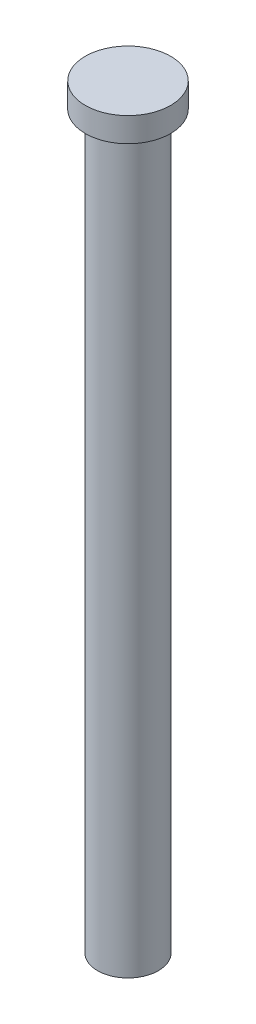
ISO-10303-21;
HEADER;
FILE_DESCRIPTION(('STEP AP214'),'2;1');
FILE_NAME('part.step','',(''),(''),'','','');
FILE_SCHEMA(('AUTOMOTIVE_DESIGN { 1 0 10303 214 1 1 1 1 }'));
ENDSEC;
DATA;
#1=APPLICATION_CONTEXT('core data for automotive mechanical design processes');
#2=APPLICATION_PROTOCOL_DEFINITION('international standard','automotive_design',2000,#1);
#3=PRODUCT_CONTEXT('',#1,'mechanical');
#4=PRODUCT('Part','Part','',(#3));
#5=PRODUCT_RELATED_PRODUCT_CATEGORY('part','',(#4));
#6=PRODUCT_DEFINITION_FORMATION('','',#4);
#7=PRODUCT_DEFINITION_CONTEXT('part definition',#1,'design');
#8=PRODUCT_DEFINITION('design','',#6,#7);
#9=PRODUCT_DEFINITION_SHAPE('','',#8);
#10=(LENGTH_UNIT() NAMED_UNIT(*) SI_UNIT(.MILLI.,.METRE.));
#11=(NAMED_UNIT(*) PLANE_ANGLE_UNIT() SI_UNIT($,.RADIAN.));
#12=(NAMED_UNIT(*) SI_UNIT($,.STERADIAN.) SOLID_ANGLE_UNIT());
#13=UNCERTAINTY_MEASURE_WITH_UNIT(LENGTH_MEASURE(1.E-05),#10,'distance_accuracy_value','');
#14=(GEOMETRIC_REPRESENTATION_CONTEXT(3) GLOBAL_UNCERTAINTY_ASSIGNED_CONTEXT((#13)) GLOBAL_UNIT_ASSIGNED_CONTEXT((#10,
#11,#12)) REPRESENTATION_CONTEXT('',''));
#15=CARTESIAN_POINT('',(0.,0.,0.));
#16=DIRECTION('',(0.,0.,1.));
#17=DIRECTION('',(1.,0.,0.));
#18=AXIS2_PLACEMENT_3D('',#15,#16,#17);
#19=CARTESIAN_POINT('',(0.,152.4,0.));
#20=DIRECTION('',(0.,-1.,0.));
#21=DIRECTION('',(0.,0.,-1.));
#22=AXIS2_PLACEMENT_3D('',#19,#20,#21);
#23=CYLINDRICAL_SURFACE('',#22,6.35);
#24=CARTESIAN_POINT('',(0.,152.4,0.));
#25=DIRECTION('',(0.,1.,0.));
#26=DIRECTION('',(0.,0.,1.));
#27=AXIS2_PLACEMENT_3D('',#24,#25,#26);
#28=CIRCLE('',#27,6.35);
#29=CARTESIAN_POINT('',(0.,152.4,-6.35));
#30=VERTEX_POINT('',#29);
#31=EDGE_CURVE('E10',#30,#30,#28,.T.);
#32=CARTESIAN_POINT('',(0.,0.,0.));
#33=DIRECTION('',(0.,1.,0.));
#34=DIRECTION('',(0.,0.,1.));
#35=AXIS2_PLACEMENT_3D('',#32,#33,#34);
#36=CIRCLE('',#35,6.35);
#37=CARTESIAN_POINT('',(0.,0.,-6.35));
#38=VERTEX_POINT('',#37);
#39=EDGE_CURVE('E38',#38,#38,#36,.T.);
#40=CARTESIAN_POINT('',(0.,152.4,-6.35));
#41=CARTESIAN_POINT('',(0.,150.8125,-6.35));
#42=CARTESIAN_POINT('',(0.,149.225,-6.35));
#43=CARTESIAN_POINT('',(0.,146.05,-6.35));
#44=CARTESIAN_POINT('',(0.,144.4625,-6.35));
#45=CARTESIAN_POINT('',(0.,141.2875,-6.35));
#46=CARTESIAN_POINT('',(0.,139.7,-6.35));
#47=CARTESIAN_POINT('',(0.,136.525,-6.35));
#48=CARTESIAN_POINT('',(0.,134.9375,-6.35));
#49=CARTESIAN_POINT('',(0.,131.7625,-6.35));
#50=CARTESIAN_POINT('',(0.,130.175,-6.35));
#51=CARTESIAN_POINT('',(0.,127.,-6.35));
#52=CARTESIAN_POINT('',(0.,125.4125,-6.35));
#53=CARTESIAN_POINT('',(0.,122.2375,-6.35));
#54=CARTESIAN_POINT('',(0.,120.65,-6.35));
#55=CARTESIAN_POINT('',(0.,117.475,-6.35));
#56=CARTESIAN_POINT('',(0.,115.8875,-6.35));
#57=CARTESIAN_POINT('',(0.,112.7125,-6.35));
#58=CARTESIAN_POINT('',(0.,111.125,-6.35));
#59=CARTESIAN_POINT('',(0.,107.95,-6.35));
#60=CARTESIAN_POINT('',(0.,106.3625,-6.35));
#61=CARTESIAN_POINT('',(0.,103.1875,-6.35));
#62=CARTESIAN_POINT('',(0.,101.6,-6.35));
#63=CARTESIAN_POINT('',(0.,98.425,-6.35));
#64=CARTESIAN_POINT('',(0.,96.8375,-6.35));
#65=CARTESIAN_POINT('',(0.,93.6625,-6.35));
#66=CARTESIAN_POINT('',(0.,92.075,-6.35));
#67=CARTESIAN_POINT('',(0.,88.9,-6.35));
#68=CARTESIAN_POINT('',(0.,87.3125,-6.35));
#69=CARTESIAN_POINT('',(0.,84.1375,-6.35));
#70=CARTESIAN_POINT('',(0.,82.55,-6.35));
#71=CARTESIAN_POINT('',(0.,79.375,-6.35));
#72=CARTESIAN_POINT('',(0.,77.7875,-6.35));
#73=CARTESIAN_POINT('',(0.,74.6125,-6.35));
#74=CARTESIAN_POINT('',(0.,73.025,-6.35));
#75=CARTESIAN_POINT('',(0.,69.85,-6.35));
#76=CARTESIAN_POINT('',(0.,68.2625,-6.35));
#77=CARTESIAN_POINT('',(0.,65.0875,-6.35));
#78=CARTESIAN_POINT('',(0.,63.5,-6.35));
#79=CARTESIAN_POINT('',(0.,60.325,-6.35));
#80=CARTESIAN_POINT('',(0.,58.7375,-6.35));
#81=CARTESIAN_POINT('',(0.,55.5625,-6.35));
#82=CARTESIAN_POINT('',(0.,53.975,-6.35));
#83=CARTESIAN_POINT('',(0.,50.8,-6.35));
#84=CARTESIAN_POINT('',(0.,49.2125,-6.35));
#85=CARTESIAN_POINT('',(0.,46.0375,-6.35));
#86=CARTESIAN_POINT('',(0.,44.45,-6.35));
#87=CARTESIAN_POINT('',(0.,41.275,-6.35));
#88=CARTESIAN_POINT('',(0.,39.6875,-6.35));
#89=CARTESIAN_POINT('',(0.,36.5125,-6.35));
#90=CARTESIAN_POINT('',(0.,34.925,-6.35));
#91=CARTESIAN_POINT('',(0.,31.75,-6.35));
#92=CARTESIAN_POINT('',(0.,30.1625,-6.35));
#93=CARTESIAN_POINT('',(0.,26.9875,-6.35));
#94=CARTESIAN_POINT('',(0.,25.4,-6.35));
#95=CARTESIAN_POINT('',(0.,22.225,-6.35));
#96=CARTESIAN_POINT('',(0.,20.6375,-6.35));
#97=CARTESIAN_POINT('',(0.,17.4625,-6.35));
#98=CARTESIAN_POINT('',(0.,15.875,-6.35));
#99=CARTESIAN_POINT('',(0.,12.7,-6.35));
#100=CARTESIAN_POINT('',(0.,11.1125,-6.35));
#101=CARTESIAN_POINT('',(0.,7.93750000000001,-6.35));
#102=CARTESIAN_POINT('',(0.,6.35,-6.35));
#103=CARTESIAN_POINT('',(0.,3.175,-6.35));
#104=CARTESIAN_POINT('',(0.,1.5875,-6.35));
#105=CARTESIAN_POINT('',(0.,0.,-6.35));
#106=B_SPLINE_CURVE_WITH_KNOTS('',3,(#40,#41,#42,#43,#44,#45,#46,#47,#48,#49,#50,#51,#52,#53,
#54,#55,#56,#57,#58,#59,#60,#61,#62,#63,#64,#65,#66,#67,#68,#69,#70,#71,#72,#73,#74,#75,#76,#77,
#78,#79,#80,#81,#82,#83,#84,#85,#86,#87,#88,#89,#90,#91,#92,#93,#94,#95,#96,#97,#98,#99,#100,
#101,#102,#103,#104,#105),.UNSPECIFIED.,.F.,.F.,(4,2,2,2,2,2,2,2,2,2,2,2,2,2,2,2,2,2,2,2,2,2,2,
2,2,2,2,2,2,2,2,2,4),(0.,4.7625,9.52500000000001,14.2875,19.05,23.8125,28.575,33.3375,38.1,
42.8625,47.625,52.3875,57.15,61.9125,66.675,71.4375,76.2,80.9625,85.725,90.4875,95.25,100.0125,
104.775,109.5375,114.3,119.0625,123.825,128.5875,133.35,138.1125,142.875,147.6375,152.4),.UNSPECIFIED.);
#107=EDGE_CURVE('BSEAM35',#30,#38,#106,.T.);
#108=ORIENTED_EDGE('',*,*,#31,.F.);
#109=ORIENTED_EDGE('',*,*,#39,.T.);
#110=ORIENTED_EDGE('',*,*,#107,.T.);
#111=ORIENTED_EDGE('',*,*,#107,.F.);
#112=EDGE_LOOP('',(#108,#110,#109,#111));
#113=FACE_BOUND('',#112,.T.);
#114=ADVANCED_FACE('F35',(#113),#23,.T.);
#115=CARTESIAN_POINT('',(0.,0.,0.));
#116=DIRECTION('',(0.,1.,0.));
#117=DIRECTION('',(0.,0.,1.));
#118=AXIS2_PLACEMENT_3D('',#115,#116,#117);
#119=PLANE('',#118);
#120=ORIENTED_EDGE('',*,*,#39,.F.);
#121=EDGE_LOOP('',(#120));
#122=FACE_BOUND('',#121,.T.);
#123=ADVANCED_FACE('F58',(#122),#119,.F.);
#124=CARTESIAN_POINT('',(0.,157.48,0.));
#125=DIRECTION('',(0.,-1.,0.));
#126=DIRECTION('',(0.,0.,-1.));
#127=AXIS2_PLACEMENT_3D('',#124,#125,#126);
#128=CYLINDRICAL_SURFACE('',#127,8.89);
#129=CARTESIAN_POINT('',(0.,157.48,0.));
#130=DIRECTION('',(0.,1.,0.));
#131=DIRECTION('',(0.,0.,1.));
#132=AXIS2_PLACEMENT_3D('',#129,#130,#131);
#133=CIRCLE('',#132,8.89);
#134=CARTESIAN_POINT('',(0.,157.48,8.89));
#135=VERTEX_POINT('',#134);
#136=EDGE_CURVE('E45',#135,#135,#133,.T.);
#137=ORIENTED_EDGE('',*,*,#136,.F.);
#138=EDGE_LOOP('',(#137));
#139=FACE_BOUND('',#138,.T.);
#140=CARTESIAN_POINT('',(0.,152.4,0.));
#141=DIRECTION('',(0.,1.,0.));
#142=DIRECTION('',(0.,0.,1.));
#143=AXIS2_PLACEMENT_3D('',#140,#141,#142);
#144=CIRCLE('',#143,8.89);
#145=CARTESIAN_POINT('',(0.,152.4,8.89));
#146=VERTEX_POINT('',#145);
#147=EDGE_CURVE('E47',#146,#146,#144,.T.);
#148=ORIENTED_EDGE('',*,*,#147,.T.);
#149=EDGE_LOOP('',(#148));
#150=FACE_BOUND('',#149,.T.);
#151=ADVANCED_FACE('F55',(#139,#150),#128,.T.);
#152=CARTESIAN_POINT('',(0.,157.48,0.));
#153=DIRECTION('',(0.,1.,0.));
#154=DIRECTION('',(0.,0.,1.));
#155=AXIS2_PLACEMENT_3D('',#152,#153,#154);
#156=PLANE('',#155);
#157=ORIENTED_EDGE('',*,*,#136,.T.);
#158=EDGE_LOOP('',(#157));
#159=FACE_BOUND('',#158,.T.);
#160=ADVANCED_FACE('F53',(#159),#156,.T.);
#161=CARTESIAN_POINT('',(0.,152.4,0.));
#162=DIRECTION('',(0.,1.,0.));
#163=DIRECTION('',(0.,0.,1.));
#164=AXIS2_PLACEMENT_3D('',#161,#162,#163);
#165=PLANE('',#164);
#166=ORIENTED_EDGE('',*,*,#31,.T.);
#167=EDGE_LOOP('',(#166));
#168=FACE_BOUND('',#167,.T.);
#169=ORIENTED_EDGE('',*,*,#147,.F.);
#170=EDGE_LOOP('',(#169));
#171=FACE_BOUND('',#170,.T.);
#172=ADVANCED_FACE('F62',(#168,#171),#165,.F.);
#173=CLOSED_SHELL('',(#114,#123,#151,#160,#172));
#174=MANIFOLD_SOLID_BREP('B2',#173);
#175=ADVANCED_BREP_SHAPE_REPRESENTATION('',(#18,#174),#14);
#176=SHAPE_DEFINITION_REPRESENTATION(#9,#175);
ENDSEC;
END-ISO-10303-21;
